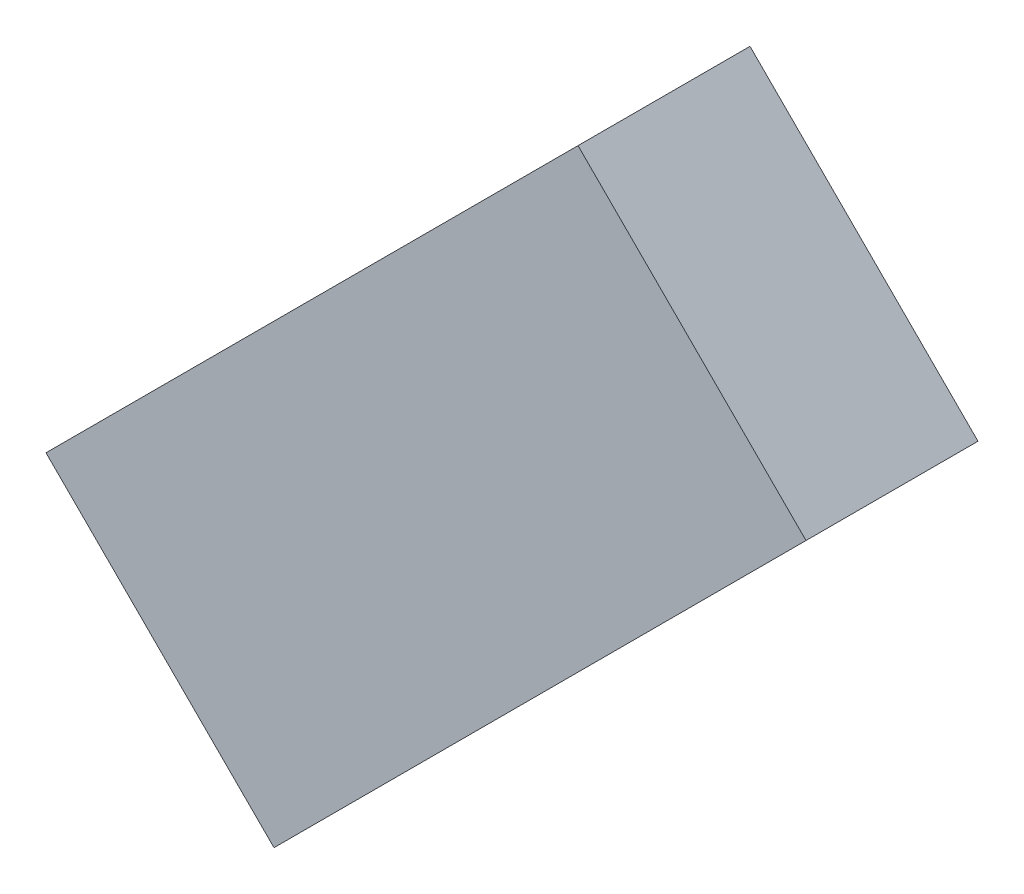
ISO-10303-21;
HEADER;
FILE_DESCRIPTION(('STEP AP214'),'2;1');
FILE_NAME('part.step','',(''),(''),'','','');
FILE_SCHEMA(('AUTOMOTIVE_DESIGN { 1 0 10303 214 1 1 1 1 }'));
ENDSEC;
DATA;
#1=APPLICATION_CONTEXT('core data for automotive mechanical design processes');
#2=APPLICATION_PROTOCOL_DEFINITION('international standard','automotive_design',2000,#1);
#3=PRODUCT_CONTEXT('',#1,'mechanical');
#4=PRODUCT('Part','Part','',(#3));
#5=PRODUCT_RELATED_PRODUCT_CATEGORY('part','',(#4));
#6=PRODUCT_DEFINITION_FORMATION('','',#4);
#7=PRODUCT_DEFINITION_CONTEXT('part definition',#1,'design');
#8=PRODUCT_DEFINITION('design','',#6,#7);
#9=PRODUCT_DEFINITION_SHAPE('','',#8);
#10=(LENGTH_UNIT() NAMED_UNIT(*) SI_UNIT(.MILLI.,.METRE.));
#11=(NAMED_UNIT(*) PLANE_ANGLE_UNIT() SI_UNIT($,.RADIAN.));
#12=(NAMED_UNIT(*) SI_UNIT($,.STERADIAN.) SOLID_ANGLE_UNIT());
#13=UNCERTAINTY_MEASURE_WITH_UNIT(LENGTH_MEASURE(1.E-05),#10,'distance_accuracy_value','');
#14=(GEOMETRIC_REPRESENTATION_CONTEXT(3) GLOBAL_UNCERTAINTY_ASSIGNED_CONTEXT((#13)) GLOBAL_UNIT_ASSIGNED_CONTEXT((#10,
#11,#12)) REPRESENTATION_CONTEXT('',''));
#15=CARTESIAN_POINT('',(0.,0.,0.));
#16=DIRECTION('',(0.,0.,1.));
#17=DIRECTION('',(1.,0.,0.));
#18=AXIS2_PLACEMENT_3D('',#15,#16,#17);
#19=CARTESIAN_POINT('',(-14.14213562373,-97.35533905932,121.));
#20=DIRECTION('',(0.,0.,1.));
#21=DIRECTION('',(1.,0.,0.));
#22=AXIS2_PLACEMENT_3D('',#19,#20,#21);
#23=PLANE('',#22);
#24=DIRECTION('',(-0.707106781186548,0.707106781186548,0.));
#25=VECTOR('',#24,1.);
#26=CARTESIAN_POINT('',(-14.14213562373,-97.35533905932,121.));
#27=LINE('',#26,#25);
#28=CARTESIAN_POINT('',(-14.14213562373,-97.35533905932,121.));
#29=VERTEX_POINT('',#28);
#30=CARTESIAN_POINT('',(-35.35533905932,-76.14213562373,121.));
#31=VERTEX_POINT('',#30);
#32=EDGE_CURVE('E100',#29,#31,#27,.T.);
#33=ORIENTED_EDGE('',*,*,#32,.F.);
#34=DIRECTION('',(0.707106781186548,0.707106781186548,0.));
#35=VECTOR('',#34,1.);
#36=CARTESIAN_POINT('',(-14.14213562373,-97.35533905932,121.));
#37=LINE('',#36,#35);
#38=CARTESIAN_POINT('',(35.355339059327,-47.85786437626,121.));
#39=VERTEX_POINT('',#38);
#40=EDGE_CURVE('E62',#29,#39,#37,.T.);
#41=ORIENTED_EDGE('',*,*,#40,.T.);
#42=DIRECTION('',(-0.707106781186548,0.707106781186548,0.));
#43=VECTOR('',#42,1.);
#44=CARTESIAN_POINT('',(35.355339059327,-47.85786437626,121.));
#45=LINE('',#44,#43);
#46=CARTESIAN_POINT('',(14.142135623731,-26.64466094067,121.));
#47=VERTEX_POINT('',#46);
#48=EDGE_CURVE('E103',#39,#47,#45,.T.);
#49=ORIENTED_EDGE('',*,*,#48,.T.);
#50=DIRECTION('',(0.707106781186548,0.707106781186548,0.));
#51=VECTOR('',#50,1.);
#52=CARTESIAN_POINT('',(-35.35533905932,-76.14213562373,121.));
#53=LINE('',#52,#51);
#54=EDGE_CURVE('E9',#31,#47,#53,.T.);
#55=ORIENTED_EDGE('',*,*,#54,.F.);
#56=EDGE_LOOP('',(#33,#41,#49,#55));
#57=FACE_BOUND('',#56,.T.);
#58=ADVANCED_FACE('F14',(#57),#23,.T.);
#59=CARTESIAN_POINT('',(-14.14213562373,-97.35533905932,105.));
#60=DIRECTION('',(0.,0.,1.));
#61=DIRECTION('',(1.,0.,0.));
#62=AXIS2_PLACEMENT_3D('',#59,#60,#61);
#63=PLANE('',#62);
#64=DIRECTION('',(0.707106781186548,0.707106781186548,0.));
#65=VECTOR('',#64,1.);
#66=CARTESIAN_POINT('',(-35.35533905932,-76.14213562373,105.));
#67=LINE('',#66,#65);
#68=CARTESIAN_POINT('',(-35.35533905932,-76.14213562373,105.));
#69=VERTEX_POINT('',#68);
#70=CARTESIAN_POINT('',(14.142135623731,-26.64466094067,105.));
#71=VERTEX_POINT('',#70);
#72=EDGE_CURVE('E24',#69,#71,#67,.T.);
#73=ORIENTED_EDGE('',*,*,#72,.T.);
#74=DIRECTION('',(-0.707106781186548,0.707106781186548,0.));
#75=VECTOR('',#74,1.);
#76=CARTESIAN_POINT('',(35.355339059327,-47.85786437626,105.));
#77=LINE('',#76,#75);
#78=CARTESIAN_POINT('',(35.355339059327,-47.85786437626,105.));
#79=VERTEX_POINT('',#78);
#80=EDGE_CURVE('E82',#79,#71,#77,.T.);
#81=ORIENTED_EDGE('',*,*,#80,.F.);
#82=DIRECTION('',(0.707106781186548,0.707106781186548,0.));
#83=VECTOR('',#82,1.);
#84=CARTESIAN_POINT('',(-14.14213562373,-97.35533905932,105.));
#85=LINE('',#84,#83);
#86=CARTESIAN_POINT('',(-14.14213562373,-97.35533905932,105.));
#87=VERTEX_POINT('',#86);
#88=EDGE_CURVE('E70',#87,#79,#85,.T.);
#89=ORIENTED_EDGE('',*,*,#88,.F.);
#90=DIRECTION('',(-0.707106781186548,0.707106781186548,0.));
#91=VECTOR('',#90,1.);
#92=CARTESIAN_POINT('',(-14.14213562373,-97.35533905932,105.));
#93=LINE('',#92,#91);
#94=EDGE_CURVE('E79',#87,#69,#93,.T.);
#95=ORIENTED_EDGE('',*,*,#94,.T.);
#96=EDGE_LOOP('',(#73,#81,#89,#95));
#97=FACE_BOUND('',#96,.T.);
#98=ADVANCED_FACE('F77',(#97),#63,.F.);
#99=CARTESIAN_POINT('',(-35.35533905932,-76.14213562373,105.));
#100=DIRECTION('',(-0.707106781186548,0.707106781186548,0.));
#101=DIRECTION('',(0.,0.,1.));
#102=AXIS2_PLACEMENT_3D('',#99,#100,#101);
#103=PLANE('',#102);
#104=ORIENTED_EDGE('',*,*,#72,.F.);
#105=DIRECTION('',(0.,0.,1.));
#106=VECTOR('',#105,1.);
#107=CARTESIAN_POINT('',(-35.35533905932,-76.14213562373,105.));
#108=LINE('',#107,#106);
#109=EDGE_CURVE('E93',#69,#31,#108,.T.);
#110=ORIENTED_EDGE('',*,*,#109,.T.);
#111=ORIENTED_EDGE('',*,*,#54,.T.);
#112=DIRECTION('',(0.,0.,1.));
#113=VECTOR('',#112,1.);
#114=CARTESIAN_POINT('',(14.142135623731,-26.64466094067,105.));
#115=LINE('',#114,#113);
#116=EDGE_CURVE('E104',#71,#47,#115,.T.);
#117=ORIENTED_EDGE('',*,*,#116,.F.);
#118=EDGE_LOOP('',(#104,#110,#111,#117));
#119=FACE_BOUND('',#118,.T.);
#120=ADVANCED_FACE('F119',(#119),#103,.T.);
#121=CARTESIAN_POINT('',(-14.14213562373,-97.35533905932,105.));
#122=DIRECTION('',(-0.707106781186548,0.707106781186548,0.));
#123=DIRECTION('',(0.,0.,1.));
#124=AXIS2_PLACEMENT_3D('',#121,#122,#123);
#125=PLANE('',#124);
#126=DIRECTION('',(0.,0.,1.));
#127=VECTOR('',#126,1.);
#128=CARTESIAN_POINT('',(35.355339059327,-47.85786437626,105.));
#129=LINE('',#128,#127);
#130=EDGE_CURVE('E17',#79,#39,#129,.T.);
#131=ORIENTED_EDGE('',*,*,#130,.T.);
#132=ORIENTED_EDGE('',*,*,#40,.F.);
#133=DIRECTION('',(0.,0.,1.));
#134=VECTOR('',#133,1.);
#135=CARTESIAN_POINT('',(-14.14213562373,-97.35533905932,105.));
#136=LINE('',#135,#134);
#137=EDGE_CURVE('E86',#87,#29,#136,.T.);
#138=ORIENTED_EDGE('',*,*,#137,.F.);
#139=ORIENTED_EDGE('',*,*,#88,.T.);
#140=EDGE_LOOP('',(#131,#132,#138,#139));
#141=FACE_BOUND('',#140,.T.);
#142=ADVANCED_FACE('F87',(#141),#125,.F.);
#143=CARTESIAN_POINT('',(35.355339059327,-47.85786437626,105.));
#144=DIRECTION('',(0.707106781186548,0.707106781186548,0.));
#145=DIRECTION('',(0.,0.,-1.));
#146=AXIS2_PLACEMENT_3D('',#143,#144,#145);
#147=PLANE('',#146);
#148=ORIENTED_EDGE('',*,*,#130,.F.);
#149=ORIENTED_EDGE('',*,*,#80,.T.);
#150=ORIENTED_EDGE('',*,*,#116,.T.);
#151=ORIENTED_EDGE('',*,*,#48,.F.);
#152=EDGE_LOOP('',(#148,#149,#150,#151));
#153=FACE_BOUND('',#152,.T.);
#154=ADVANCED_FACE('F120',(#153),#147,.T.);
#155=CARTESIAN_POINT('',(-14.14213562373,-97.35533905932,105.));
#156=DIRECTION('',(0.707106781186548,0.707106781186548,0.));
#157=DIRECTION('',(0.,0.,-1.));
#158=AXIS2_PLACEMENT_3D('',#155,#156,#157);
#159=PLANE('',#158);
#160=ORIENTED_EDGE('',*,*,#32,.T.);
#161=ORIENTED_EDGE('',*,*,#109,.F.);
#162=ORIENTED_EDGE('',*,*,#94,.F.);
#163=ORIENTED_EDGE('',*,*,#137,.T.);
#164=EDGE_LOOP('',(#160,#161,#162,#163));
#165=FACE_BOUND('',#164,.T.);
#166=ADVANCED_FACE('F92',(#165),#159,.F.);
#167=CLOSED_SHELL('',(#58,#98,#120,#142,#154,#166));
#168=MANIFOLD_SOLID_BREP('B1',#167);
#169=ADVANCED_BREP_SHAPE_REPRESENTATION('',(#18,#168),#14);
#170=SHAPE_DEFINITION_REPRESENTATION(#9,#169);
ENDSEC;
END-ISO-10303-21;
